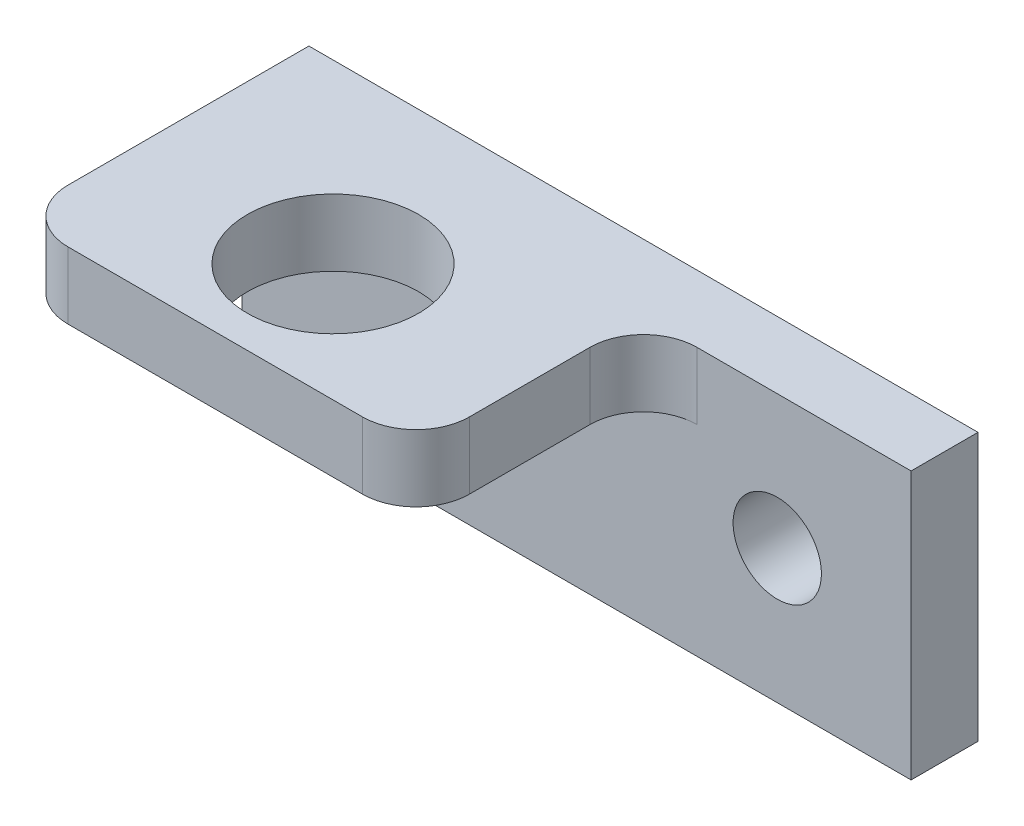
ISO-10303-21;
HEADER;
FILE_DESCRIPTION(('STEP AP214'),'2;1');
FILE_NAME('part.step','',(''),(''),'','','');
FILE_SCHEMA(('AUTOMOTIVE_DESIGN { 1 0 10303 214 1 1 1 1 }'));
ENDSEC;
DATA;
#1=APPLICATION_CONTEXT('core data for automotive mechanical design processes');
#2=APPLICATION_PROTOCOL_DEFINITION('international standard','automotive_design',2000,#1);
#3=PRODUCT_CONTEXT('',#1,'mechanical');
#4=PRODUCT('Part','Part','',(#3));
#5=PRODUCT_RELATED_PRODUCT_CATEGORY('part','',(#4));
#6=PRODUCT_DEFINITION_FORMATION('','',#4);
#7=PRODUCT_DEFINITION_CONTEXT('part definition',#1,'design');
#8=PRODUCT_DEFINITION('design','',#6,#7);
#9=PRODUCT_DEFINITION_SHAPE('','',#8);
#10=(LENGTH_UNIT() NAMED_UNIT(*) SI_UNIT(.MILLI.,.METRE.));
#11=(NAMED_UNIT(*) PLANE_ANGLE_UNIT() SI_UNIT($,.RADIAN.));
#12=(NAMED_UNIT(*) SI_UNIT($,.STERADIAN.) SOLID_ANGLE_UNIT());
#13=UNCERTAINTY_MEASURE_WITH_UNIT(LENGTH_MEASURE(1.E-05),#10,'distance_accuracy_value','');
#14=(GEOMETRIC_REPRESENTATION_CONTEXT(3) GLOBAL_UNCERTAINTY_ASSIGNED_CONTEXT((#13)) GLOBAL_UNIT_ASSIGNED_CONTEXT((#10,
#11,#12)) REPRESENTATION_CONTEXT('',''));
#15=CARTESIAN_POINT('',(0.,0.,0.));
#16=DIRECTION('',(0.,0.,1.));
#17=DIRECTION('',(1.,0.,0.));
#18=AXIS2_PLACEMENT_3D('',#15,#16,#17);
#19=CARTESIAN_POINT('',(0.,0.,2.5));
#20=DIRECTION('',(0.,0.,-1.));
#21=DIRECTION('',(-1.,0.,0.));
#22=AXIS2_PLACEMENT_3D('',#19,#20,#21);
#23=PLANE('',#22);
#24=CARTESIAN_POINT('',(20.,5.,2.5));
#25=DIRECTION('',(0.,0.,1.));
#26=DIRECTION('',(1.,0.,0.));
#27=AXIS2_PLACEMENT_3D('',#24,#25,#26);
#28=CIRCLE('',#27,1.65);
#29=CARTESIAN_POINT('',(21.65,5.,2.5));
#30=VERTEX_POINT('',#29);
#31=EDGE_CURVE('E181',#30,#30,#28,.T.);
#32=ORIENTED_EDGE('',*,*,#31,.F.);
#33=EDGE_LOOP('',(#32));
#34=FACE_BOUND('',#33,.T.);
#35=DIRECTION('',(-1.,0.,0.));
#36=VECTOR('',#35,1.);
#37=CARTESIAN_POINT('',(0.,10.,2.5));
#38=LINE('',#37,#36);
#39=CARTESIAN_POINT('',(25.,10.,2.5));
#40=VERTEX_POINT('',#39);
#41=CARTESIAN_POINT('',(17.,10.,2.5));
#42=VERTEX_POINT('',#41);
#43=EDGE_CURVE('E159',#40,#42,#38,.T.);
#44=ORIENTED_EDGE('',*,*,#43,.T.);
#45=DIRECTION('',(0.,1.,0.));
#46=VECTOR('',#45,1.);
#47=CARTESIAN_POINT('',(17.,7.5,2.5));
#48=LINE('',#47,#46);
#49=CARTESIAN_POINT('',(17.,7.5,2.5));
#50=VERTEX_POINT('',#49);
#51=EDGE_CURVE('E156',#42,#50,#48,.F.);
#52=ORIENTED_EDGE('',*,*,#51,.T.);
#53=DIRECTION('',(1.,0.,0.));
#54=VECTOR('',#53,1.);
#55=CARTESIAN_POINT('',(0.,7.5,2.5));
#56=LINE('',#55,#54);
#57=CARTESIAN_POINT('',(0.,7.5,2.5));
#58=VERTEX_POINT('',#57);
#59=EDGE_CURVE('E47',#58,#50,#56,.T.);
#60=ORIENTED_EDGE('',*,*,#59,.F.);
#61=DIRECTION('',(0.,-1.,0.));
#62=VECTOR('',#61,1.);
#63=CARTESIAN_POINT('',(0.,0.,2.5));
#64=LINE('',#63,#62);
#65=CARTESIAN_POINT('',(0.,0.,2.5));
#66=VERTEX_POINT('',#65);
#67=EDGE_CURVE('E108',#58,#66,#64,.T.);
#68=ORIENTED_EDGE('',*,*,#67,.T.);
#69=DIRECTION('',(1.,0.,0.));
#70=VECTOR('',#69,1.);
#71=CARTESIAN_POINT('',(0.,0.,2.5));
#72=LINE('',#71,#70);
#73=CARTESIAN_POINT('',(25.,0.,2.5));
#74=VERTEX_POINT('',#73);
#75=EDGE_CURVE('E110',#66,#74,#72,.T.);
#76=ORIENTED_EDGE('',*,*,#75,.T.);
#77=DIRECTION('',(0.,1.,0.));
#78=VECTOR('',#77,1.);
#79=CARTESIAN_POINT('',(25.,0.,2.5));
#80=LINE('',#79,#78);
#81=EDGE_CURVE('E125',#74,#40,#80,.T.);
#82=ORIENTED_EDGE('',*,*,#81,.T.);
#83=EDGE_LOOP('',(#44,#52,#60,#68,#76,#82));
#84=FACE_BOUND('',#83,.T.);
#85=ADVANCED_FACE('F33',(#34,#84),#23,.F.);
#86=CARTESIAN_POINT('',(0.,0.,0.));
#87=DIRECTION('',(0.,0.,-1.));
#88=DIRECTION('',(-1.,0.,0.));
#89=AXIS2_PLACEMENT_3D('',#86,#87,#88);
#90=PLANE('',#89);
#91=DIRECTION('',(0.,-1.,0.));
#92=VECTOR('',#91,1.);
#93=CARTESIAN_POINT('',(0.,0.,0.));
#94=LINE('',#93,#92);
#95=CARTESIAN_POINT('',(0.,10.,0.));
#96=VERTEX_POINT('',#95);
#97=CARTESIAN_POINT('',(0.,0.,0.));
#98=VERTEX_POINT('',#97);
#99=EDGE_CURVE('E129',#96,#98,#94,.T.);
#100=ORIENTED_EDGE('',*,*,#99,.F.);
#101=DIRECTION('',(-1.,0.,0.));
#102=VECTOR('',#101,1.);
#103=CARTESIAN_POINT('',(0.,10.,0.));
#104=LINE('',#103,#102);
#105=CARTESIAN_POINT('',(25.,10.,0.));
#106=VERTEX_POINT('',#105);
#107=EDGE_CURVE('E115',#106,#96,#104,.T.);
#108=ORIENTED_EDGE('',*,*,#107,.F.);
#109=DIRECTION('',(0.,1.,0.));
#110=VECTOR('',#109,1.);
#111=CARTESIAN_POINT('',(25.,0.,0.));
#112=LINE('',#111,#110);
#113=CARTESIAN_POINT('',(25.,0.,0.));
#114=VERTEX_POINT('',#113);
#115=EDGE_CURVE('E192',#114,#106,#112,.T.);
#116=ORIENTED_EDGE('',*,*,#115,.F.);
#117=DIRECTION('',(1.,0.,0.));
#118=VECTOR('',#117,1.);
#119=CARTESIAN_POINT('',(0.,0.,0.));
#120=LINE('',#119,#118);
#121=EDGE_CURVE('E190',#98,#114,#120,.T.);
#122=ORIENTED_EDGE('',*,*,#121,.F.);
#123=EDGE_LOOP('',(#100,#108,#116,#122));
#124=FACE_BOUND('',#123,.T.);
#125=CARTESIAN_POINT('',(20.,5.,0.));
#126=DIRECTION('',(0.,0.,1.));
#127=DIRECTION('',(1.,0.,0.));
#128=AXIS2_PLACEMENT_3D('',#125,#126,#127);
#129=CIRCLE('',#128,1.65);
#130=CARTESIAN_POINT('',(21.65,5.,0.));
#131=VERTEX_POINT('',#130);
#132=EDGE_CURVE('E175',#131,#131,#129,.T.);
#133=ORIENTED_EDGE('',*,*,#132,.T.);
#134=EDGE_LOOP('',(#133));
#135=FACE_BOUND('',#134,.T.);
#136=ADVANCED_FACE('F204',(#124,#135),#90,.T.);
#137=CARTESIAN_POINT('',(0.,0.,2.5));
#138=DIRECTION('',(1.,0.,0.));
#139=DIRECTION('',(0.,0.,-1.));
#140=AXIS2_PLACEMENT_3D('',#137,#138,#139);
#141=PLANE('',#140);
#142=DIRECTION('',(0.,0.,-1.));
#143=VECTOR('',#142,1.);
#144=CARTESIAN_POINT('',(0.,7.5,11.));
#145=LINE('',#144,#143);
#146=CARTESIAN_POINT('',(0.,7.5,9.));
#147=VERTEX_POINT('',#146);
#148=EDGE_CURVE('E172',#147,#58,#145,.T.);
#149=ORIENTED_EDGE('',*,*,#148,.F.);
#150=DIRECTION('',(0.,-1.,0.));
#151=VECTOR('',#150,1.);
#152=CARTESIAN_POINT('',(0.,10.,9.));
#153=LINE('',#152,#151);
#154=CARTESIAN_POINT('',(0.,10.,9.));
#155=VERTEX_POINT('',#154);
#156=EDGE_CURVE('E145',#147,#155,#153,.F.);
#157=ORIENTED_EDGE('',*,*,#156,.T.);
#158=DIRECTION('',(0.,0.,-1.));
#159=VECTOR('',#158,1.);
#160=CARTESIAN_POINT('',(0.,10.,2.5));
#161=LINE('',#160,#159);
#162=EDGE_CURVE('E188',#155,#96,#161,.T.);
#163=ORIENTED_EDGE('',*,*,#162,.T.);
#164=ORIENTED_EDGE('',*,*,#99,.T.);
#165=DIRECTION('',(0.,0.,-1.));
#166=VECTOR('',#165,1.);
#167=CARTESIAN_POINT('',(0.,0.,2.5));
#168=LINE('',#167,#166);
#169=EDGE_CURVE('E120',#66,#98,#168,.T.);
#170=ORIENTED_EDGE('',*,*,#169,.F.);
#171=ORIENTED_EDGE('',*,*,#67,.F.);
#172=EDGE_LOOP('',(#149,#157,#163,#164,#170,#171));
#173=FACE_BOUND('',#172,.T.);
#174=ADVANCED_FACE('F127',(#173),#141,.F.);
#175=CARTESIAN_POINT('',(0.,0.,2.5));
#176=DIRECTION('',(0.,1.,0.));
#177=DIRECTION('',(0.,0.,1.));
#178=AXIS2_PLACEMENT_3D('',#175,#176,#177);
#179=PLANE('',#178);
#180=ORIENTED_EDGE('',*,*,#121,.T.);
#181=DIRECTION('',(0.,0.,-1.));
#182=VECTOR('',#181,1.);
#183=CARTESIAN_POINT('',(25.,0.,2.5));
#184=LINE('',#183,#182);
#185=EDGE_CURVE('E123',#74,#114,#184,.T.);
#186=ORIENTED_EDGE('',*,*,#185,.F.);
#187=ORIENTED_EDGE('',*,*,#75,.F.);
#188=ORIENTED_EDGE('',*,*,#169,.T.);
#189=EDGE_LOOP('',(#180,#186,#187,#188));
#190=FACE_BOUND('',#189,.T.);
#191=ADVANCED_FACE('F119',(#190),#179,.F.);
#192=CARTESIAN_POINT('',(25.,0.,2.5));
#193=DIRECTION('',(-1.,0.,0.));
#194=DIRECTION('',(0.,0.,1.));
#195=AXIS2_PLACEMENT_3D('',#192,#193,#194);
#196=PLANE('',#195);
#197=ORIENTED_EDGE('',*,*,#115,.T.);
#198=DIRECTION('',(0.,0.,-1.));
#199=VECTOR('',#198,1.);
#200=CARTESIAN_POINT('',(25.,10.,2.5));
#201=LINE('',#200,#199);
#202=EDGE_CURVE('E135',#40,#106,#201,.T.);
#203=ORIENTED_EDGE('',*,*,#202,.F.);
#204=ORIENTED_EDGE('',*,*,#81,.F.);
#205=ORIENTED_EDGE('',*,*,#185,.T.);
#206=EDGE_LOOP('',(#197,#203,#204,#205));
#207=FACE_BOUND('',#206,.T.);
#208=ADVANCED_FACE('F206',(#207),#196,.F.);
#209=CARTESIAN_POINT('',(0.,10.,2.5));
#210=DIRECTION('',(0.,-1.,0.));
#211=DIRECTION('',(0.,0.,-1.));
#212=AXIS2_PLACEMENT_3D('',#209,#210,#211);
#213=PLANE('',#212);
#214=CARTESIAN_POINT('',(7.5,10.,6.6));
#215=DIRECTION('',(0.,-1.,0.));
#216=DIRECTION('',(0.,0.,-1.));
#217=AXIS2_PLACEMENT_3D('',#214,#215,#216);
#218=CIRCLE('',#217,3.2);
#219=CARTESIAN_POINT('',(7.5,10.,3.4));
#220=VERTEX_POINT('',#219);
#221=EDGE_CURVE('E252',#220,#220,#218,.T.);
#222=ORIENTED_EDGE('',*,*,#221,.T.);
#223=EDGE_LOOP('',(#222));
#224=FACE_BOUND('',#223,.T.);
#225=ORIENTED_EDGE('',*,*,#162,.F.);
#226=CARTESIAN_POINT('',(2.,10.,9.));
#227=DIRECTION('',(0.,-1.,0.));
#228=DIRECTION('',(0.,0.,-1.));
#229=AXIS2_PLACEMENT_3D('',#226,#227,#228);
#230=CIRCLE('',#229,2.);
#231=CARTESIAN_POINT('',(2.,10.,11.));
#232=VERTEX_POINT('',#231);
#233=EDGE_CURVE('E149',#155,#232,#230,.F.);
#234=ORIENTED_EDGE('',*,*,#233,.T.);
#235=DIRECTION('',(-1.,0.,0.));
#236=VECTOR('',#235,1.);
#237=CARTESIAN_POINT('',(0.,10.,11.));
#238=LINE('',#237,#236);
#239=CARTESIAN_POINT('',(13.,10.,11.));
#240=VERTEX_POINT('',#239);
#241=EDGE_CURVE('E177',#240,#232,#238,.T.);
#242=ORIENTED_EDGE('',*,*,#241,.F.);
#243=CARTESIAN_POINT('',(13.,10.,9.));
#244=DIRECTION('',(0.,-1.,0.));
#245=DIRECTION('',(0.,0.,-1.));
#246=AXIS2_PLACEMENT_3D('',#243,#244,#245);
#247=CIRCLE('',#246,2.);
#248=CARTESIAN_POINT('',(15.,10.,9.));
#249=VERTEX_POINT('',#248);
#250=EDGE_CURVE('E147',#240,#249,#247,.F.);
#251=ORIENTED_EDGE('',*,*,#250,.T.);
#252=DIRECTION('',(0.,0.,-1.));
#253=VECTOR('',#252,1.);
#254=CARTESIAN_POINT('',(15.,10.,11.));
#255=LINE('',#254,#253);
#256=CARTESIAN_POINT('',(15.,10.,4.5));
#257=VERTEX_POINT('',#256);
#258=EDGE_CURVE('E173',#249,#257,#255,.T.);
#259=ORIENTED_EDGE('',*,*,#258,.T.);
#260=CARTESIAN_POINT('',(17.,10.,4.5));
#261=DIRECTION('',(0.,-1.,0.));
#262=DIRECTION('',(0.,0.,-1.));
#263=AXIS2_PLACEMENT_3D('',#260,#261,#262);
#264=CIRCLE('',#263,2.);
#265=EDGE_CURVE('E41',#257,#42,#264,.T.);
#266=ORIENTED_EDGE('',*,*,#265,.T.);
#267=ORIENTED_EDGE('',*,*,#43,.F.);
#268=ORIENTED_EDGE('',*,*,#202,.T.);
#269=ORIENTED_EDGE('',*,*,#107,.T.);
#270=EDGE_LOOP('',(#225,#234,#242,#251,#259,#266,#267,#268,#269));
#271=FACE_BOUND('',#270,.T.);
#272=ADVANCED_FACE('F200',(#224,#271),#213,.F.);
#273=CARTESIAN_POINT('',(20.,5.,2.5));
#274=DIRECTION('',(0.,0.,-1.));
#275=DIRECTION('',(-1.,0.,0.));
#276=AXIS2_PLACEMENT_3D('',#273,#274,#275);
#277=CYLINDRICAL_SURFACE('',#276,1.65);
#278=ORIENTED_EDGE('',*,*,#31,.T.);
#279=EDGE_LOOP('',(#278));
#280=FACE_BOUND('',#279,.T.);
#281=ORIENTED_EDGE('',*,*,#132,.F.);
#282=EDGE_LOOP('',(#281));
#283=FACE_BOUND('',#282,.T.);
#284=ADVANCED_FACE('F213',(#280,#283),#277,.F.);
#285=CARTESIAN_POINT('',(0.,7.5,11.));
#286=DIRECTION('',(0.,1.,0.));
#287=DIRECTION('',(0.,0.,1.));
#288=AXIS2_PLACEMENT_3D('',#285,#286,#287);
#289=PLANE('',#288);
#290=CARTESIAN_POINT('',(7.5,7.5,6.6));
#291=DIRECTION('',(0.,-1.,0.));
#292=DIRECTION('',(0.,0.,-1.));
#293=AXIS2_PLACEMENT_3D('',#290,#291,#292);
#294=CIRCLE('',#293,3.2);
#295=CARTESIAN_POINT('',(7.5,7.5,3.4));
#296=VERTEX_POINT('',#295);
#297=EDGE_CURVE('E249',#296,#296,#294,.T.);
#298=ORIENTED_EDGE('',*,*,#297,.F.);
#299=EDGE_LOOP('',(#298));
#300=FACE_BOUND('',#299,.T.);
#301=DIRECTION('',(1.,0.,0.));
#302=VECTOR('',#301,1.);
#303=CARTESIAN_POINT('',(0.,7.5,11.));
#304=LINE('',#303,#302);
#305=CARTESIAN_POINT('',(2.,7.5,11.));
#306=VERTEX_POINT('',#305);
#307=CARTESIAN_POINT('',(13.,7.5,11.));
#308=VERTEX_POINT('',#307);
#309=EDGE_CURVE('E254',#306,#308,#304,.T.);
#310=ORIENTED_EDGE('',*,*,#309,.F.);
#311=CARTESIAN_POINT('',(2.,7.5,9.));
#312=DIRECTION('',(0.,1.,0.));
#313=DIRECTION('',(0.,0.,1.));
#314=AXIS2_PLACEMENT_3D('',#311,#312,#313);
#315=CIRCLE('',#314,2.);
#316=EDGE_CURVE('E143',#306,#147,#315,.F.);
#317=ORIENTED_EDGE('',*,*,#316,.T.);
#318=ORIENTED_EDGE('',*,*,#148,.T.);
#319=ORIENTED_EDGE('',*,*,#59,.T.);
#320=CARTESIAN_POINT('',(17.,7.5,4.5));
#321=DIRECTION('',(0.,1.,0.));
#322=DIRECTION('',(0.,0.,1.));
#323=AXIS2_PLACEMENT_3D('',#320,#321,#322);
#324=CIRCLE('',#323,2.);
#325=CARTESIAN_POINT('',(15.,7.5,4.5));
#326=VERTEX_POINT('',#325);
#327=EDGE_CURVE('E11',#50,#326,#324,.T.);
#328=ORIENTED_EDGE('',*,*,#327,.T.);
#329=DIRECTION('',(0.,0.,-1.));
#330=VECTOR('',#329,1.);
#331=CARTESIAN_POINT('',(15.,7.5,11.));
#332=LINE('',#331,#330);
#333=CARTESIAN_POINT('',(15.,7.5,9.));
#334=VERTEX_POINT('',#333);
#335=EDGE_CURVE('E166',#334,#326,#332,.T.);
#336=ORIENTED_EDGE('',*,*,#335,.F.);
#337=CARTESIAN_POINT('',(13.,7.5,9.));
#338=DIRECTION('',(0.,1.,0.));
#339=DIRECTION('',(0.,0.,1.));
#340=AXIS2_PLACEMENT_3D('',#337,#338,#339);
#341=CIRCLE('',#340,2.);
#342=EDGE_CURVE('E141',#334,#308,#341,.F.);
#343=ORIENTED_EDGE('',*,*,#342,.T.);
#344=EDGE_LOOP('',(#310,#317,#318,#319,#328,#336,#343));
#345=FACE_BOUND('',#344,.T.);
#346=ADVANCED_FACE('F165',(#300,#345),#289,.F.);
#347=CARTESIAN_POINT('',(15.,10.,11.));
#348=DIRECTION('',(-1.,0.,0.));
#349=DIRECTION('',(0.,0.,1.));
#350=AXIS2_PLACEMENT_3D('',#347,#348,#349);
#351=PLANE('',#350);
#352=ORIENTED_EDGE('',*,*,#258,.F.);
#353=DIRECTION('',(0.,1.,0.));
#354=VECTOR('',#353,1.);
#355=CARTESIAN_POINT('',(15.,7.5,9.));
#356=LINE('',#355,#354);
#357=EDGE_CURVE('E154',#249,#334,#356,.F.);
#358=ORIENTED_EDGE('',*,*,#357,.T.);
#359=ORIENTED_EDGE('',*,*,#335,.T.);
#360=DIRECTION('',(0.,1.,0.));
#361=VECTOR('',#360,1.);
#362=CARTESIAN_POINT('',(15.,10.,4.5));
#363=LINE('',#362,#361);
#364=EDGE_CURVE('E151',#326,#257,#363,.T.);
#365=ORIENTED_EDGE('',*,*,#364,.T.);
#366=EDGE_LOOP('',(#352,#358,#359,#365));
#367=FACE_BOUND('',#366,.T.);
#368=ADVANCED_FACE('F170',(#367),#351,.F.);
#369=CARTESIAN_POINT('',(0.,0.,11.));
#370=DIRECTION('',(0.,0.,1.));
#371=DIRECTION('',(1.,0.,0.));
#372=AXIS2_PLACEMENT_3D('',#369,#370,#371);
#373=PLANE('',#372);
#374=ORIENTED_EDGE('',*,*,#241,.T.);
#375=DIRECTION('',(0.,-1.,0.));
#376=VECTOR('',#375,1.);
#377=CARTESIAN_POINT('',(2.,7.5,11.));
#378=LINE('',#377,#376);
#379=EDGE_CURVE('E133',#232,#306,#378,.T.);
#380=ORIENTED_EDGE('',*,*,#379,.T.);
#381=ORIENTED_EDGE('',*,*,#309,.T.);
#382=DIRECTION('',(0.,1.,0.));
#383=VECTOR('',#382,1.);
#384=CARTESIAN_POINT('',(13.,10.,11.));
#385=LINE('',#384,#383);
#386=EDGE_CURVE('E130',#308,#240,#385,.T.);
#387=ORIENTED_EDGE('',*,*,#386,.T.);
#388=EDGE_LOOP('',(#374,#380,#381,#387));
#389=FACE_BOUND('',#388,.T.);
#390=ADVANCED_FACE('F234',(#389),#373,.T.);
#391=CARTESIAN_POINT('',(2.,0.,9.));
#392=DIRECTION('',(0.,1.,0.));
#393=DIRECTION('',(0.,0.,1.));
#394=AXIS2_PLACEMENT_3D('',#391,#392,#393);
#395=CYLINDRICAL_SURFACE('',#394,2.);
#396=ORIENTED_EDGE('',*,*,#233,.F.);
#397=ORIENTED_EDGE('',*,*,#156,.F.);
#398=ORIENTED_EDGE('',*,*,#316,.F.);
#399=ORIENTED_EDGE('',*,*,#379,.F.);
#400=EDGE_LOOP('',(#396,#397,#398,#399));
#401=FACE_BOUND('',#400,.T.);
#402=ADVANCED_FACE('F237',(#401),#395,.T.);
#403=CARTESIAN_POINT('',(13.,0.,9.));
#404=DIRECTION('',(0.,-1.,0.));
#405=DIRECTION('',(0.,0.,-1.));
#406=AXIS2_PLACEMENT_3D('',#403,#404,#405);
#407=CYLINDRICAL_SURFACE('',#406,2.);
#408=ORIENTED_EDGE('',*,*,#342,.F.);
#409=ORIENTED_EDGE('',*,*,#357,.F.);
#410=ORIENTED_EDGE('',*,*,#250,.F.);
#411=ORIENTED_EDGE('',*,*,#386,.F.);
#412=EDGE_LOOP('',(#408,#409,#410,#411));
#413=FACE_BOUND('',#412,.T.);
#414=ADVANCED_FACE('F245',(#413),#407,.T.);
#415=CARTESIAN_POINT('',(17.,10.,4.5));
#416=DIRECTION('',(0.,-1.,0.));
#417=DIRECTION('',(0.,0.,-1.));
#418=AXIS2_PLACEMENT_3D('',#415,#416,#417);
#419=CYLINDRICAL_SURFACE('',#418,2.);
#420=ORIENTED_EDGE('',*,*,#327,.F.);
#421=ORIENTED_EDGE('',*,*,#51,.F.);
#422=ORIENTED_EDGE('',*,*,#265,.F.);
#423=ORIENTED_EDGE('',*,*,#364,.F.);
#424=EDGE_LOOP('',(#420,#421,#422,#423));
#425=FACE_BOUND('',#424,.T.);
#426=ADVANCED_FACE('F35',(#425),#419,.F.);
#427=CARTESIAN_POINT('',(7.5,16.,6.6));
#428=DIRECTION('',(0.,-1.,0.));
#429=DIRECTION('',(0.,0.,-1.));
#430=AXIS2_PLACEMENT_3D('',#427,#428,#429);
#431=CYLINDRICAL_SURFACE('',#430,3.2);
#432=ORIENTED_EDGE('',*,*,#297,.T.);
#433=EDGE_LOOP('',(#432));
#434=FACE_BOUND('',#433,.T.);
#435=ORIENTED_EDGE('',*,*,#221,.F.);
#436=EDGE_LOOP('',(#435));
#437=FACE_BOUND('',#436,.T.);
#438=ADVANCED_FACE('F239',(#434,#437),#431,.F.);
#439=CLOSED_SHELL('',(#85,#136,#174,#191,#208,#272,#284,#346,#368,#390,#402,#414,#426,#438));
#440=MANIFOLD_SOLID_BREP('B2',#439);
#441=ADVANCED_BREP_SHAPE_REPRESENTATION('',(#18,#440),#14);
#442=SHAPE_DEFINITION_REPRESENTATION(#9,#441);
ENDSEC;
END-ISO-10303-21;
